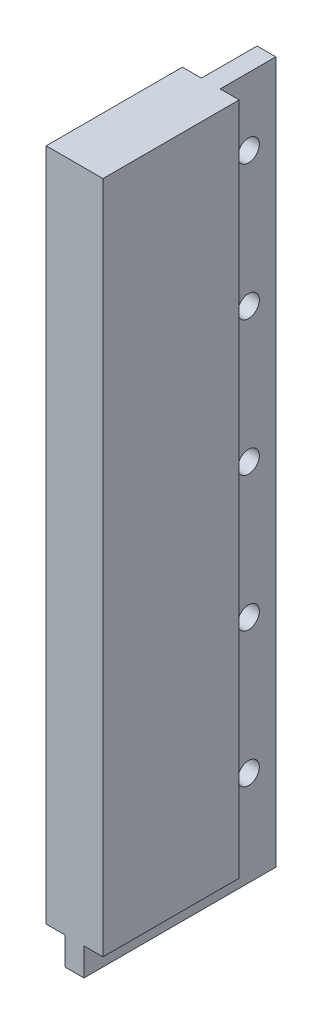
ISO-10303-21;
HEADER;
FILE_DESCRIPTION(('STEP AP214'),'2;1');
FILE_NAME('part.step','',(''),(''),'','','');
FILE_SCHEMA(('AUTOMOTIVE_DESIGN { 1 0 10303 214 1 1 1 1 }'));
ENDSEC;
DATA;
#1=APPLICATION_CONTEXT('core data for automotive mechanical design processes');
#2=APPLICATION_PROTOCOL_DEFINITION('international standard','automotive_design',2000,#1);
#3=PRODUCT_CONTEXT('',#1,'mechanical');
#4=PRODUCT('Part','Part','',(#3));
#5=PRODUCT_RELATED_PRODUCT_CATEGORY('part','',(#4));
#6=PRODUCT_DEFINITION_FORMATION('','',#4);
#7=PRODUCT_DEFINITION_CONTEXT('part definition',#1,'design');
#8=PRODUCT_DEFINITION('design','',#6,#7);
#9=PRODUCT_DEFINITION_SHAPE('','',#8);
#10=(LENGTH_UNIT() NAMED_UNIT(*) SI_UNIT(.MILLI.,.METRE.));
#11=(NAMED_UNIT(*) PLANE_ANGLE_UNIT() SI_UNIT($,.RADIAN.));
#12=(NAMED_UNIT(*) SI_UNIT($,.STERADIAN.) SOLID_ANGLE_UNIT());
#13=UNCERTAINTY_MEASURE_WITH_UNIT(LENGTH_MEASURE(1.E-05),#10,'distance_accuracy_value','');
#14=(GEOMETRIC_REPRESENTATION_CONTEXT(3) GLOBAL_UNCERTAINTY_ASSIGNED_CONTEXT((#13)) GLOBAL_UNIT_ASSIGNED_CONTEXT((#10,
#11,#12)) REPRESENTATION_CONTEXT('',''));
#15=CARTESIAN_POINT('',(0.,0.,0.));
#16=DIRECTION('',(0.,0.,1.));
#17=DIRECTION('',(1.,0.,0.));
#18=AXIS2_PLACEMENT_3D('',#15,#16,#17);
#19=CARTESIAN_POINT('',(0.00100000000000013,11.875,-5.00000000000001));
#20=DIRECTION('',(-1.,0.,0.));
#21=DIRECTION('',(0.,0.,1.));
#22=AXIS2_PLACEMENT_3D('',#19,#20,#21);
#23=CYLINDRICAL_SURFACE('',#22,1.9);
#24=CARTESIAN_POINT('',(-6.65,11.875,-5.00000000000001));
#25=DIRECTION('',(-1.,0.,0.));
#26=DIRECTION('',(0.,0.,1.));
#27=AXIS2_PLACEMENT_3D('',#24,#25,#26);
#28=CIRCLE('',#27,1.9);
#29=CARTESIAN_POINT('',(-6.65,11.875,-3.10000000000001));
#30=VERTEX_POINT('',#29);
#31=EDGE_CURVE('E55',#30,#30,#28,.T.);
#32=CARTESIAN_POINT('',(-3.35,11.875,-5.00000000000001));
#33=DIRECTION('',(-1.,0.,0.));
#34=DIRECTION('',(0.,0.,1.));
#35=AXIS2_PLACEMENT_3D('',#32,#33,#34);
#36=CIRCLE('',#35,1.9);
#37=CARTESIAN_POINT('',(-3.35,11.875,-3.10000000000001));
#38=VERTEX_POINT('',#37);
#39=EDGE_CURVE('E11',#38,#38,#36,.F.);
#40=CARTESIAN_POINT('',(-6.65,11.875,-3.10000000000001));
#41=CARTESIAN_POINT('',(-6.615625,11.875,-3.10000000000001));
#42=CARTESIAN_POINT('',(-6.58125,11.875,-3.10000000000001));
#43=CARTESIAN_POINT('',(-6.5125,11.875,-3.10000000000001));
#44=CARTESIAN_POINT('',(-6.478125,11.875,-3.10000000000001));
#45=CARTESIAN_POINT('',(-6.409375,11.875,-3.10000000000001));
#46=CARTESIAN_POINT('',(-6.375,11.875,-3.10000000000001));
#47=CARTESIAN_POINT('',(-6.30625,11.875,-3.10000000000001));
#48=CARTESIAN_POINT('',(-6.271875,11.875,-3.10000000000001));
#49=CARTESIAN_POINT('',(-6.203125,11.875,-3.10000000000001));
#50=CARTESIAN_POINT('',(-6.16875,11.875,-3.10000000000001));
#51=CARTESIAN_POINT('',(-6.1,11.875,-3.10000000000001));
#52=CARTESIAN_POINT('',(-6.065625,11.875,-3.10000000000001));
#53=CARTESIAN_POINT('',(-5.996875,11.875,-3.10000000000001));
#54=CARTESIAN_POINT('',(-5.9625,11.875,-3.10000000000001));
#55=CARTESIAN_POINT('',(-5.89375,11.875,-3.10000000000001));
#56=CARTESIAN_POINT('',(-5.859375,11.875,-3.10000000000001));
#57=CARTESIAN_POINT('',(-5.790625,11.875,-3.10000000000001));
#58=CARTESIAN_POINT('',(-5.75625,11.875,-3.10000000000001));
#59=CARTESIAN_POINT('',(-5.6875,11.875,-3.10000000000001));
#60=CARTESIAN_POINT('',(-5.653125,11.875,-3.10000000000001));
#61=CARTESIAN_POINT('',(-5.584375,11.875,-3.10000000000001));
#62=CARTESIAN_POINT('',(-5.55,11.875,-3.10000000000001));
#63=CARTESIAN_POINT('',(-5.48125,11.875,-3.10000000000001));
#64=CARTESIAN_POINT('',(-5.446875,11.875,-3.10000000000001));
#65=CARTESIAN_POINT('',(-5.378125,11.875,-3.10000000000001));
#66=CARTESIAN_POINT('',(-5.34375,11.875,-3.10000000000001));
#67=CARTESIAN_POINT('',(-5.275,11.875,-3.10000000000001));
#68=CARTESIAN_POINT('',(-5.240625,11.875,-3.10000000000001));
#69=CARTESIAN_POINT('',(-5.171875,11.875,-3.10000000000001));
#70=CARTESIAN_POINT('',(-5.1375,11.875,-3.10000000000001));
#71=CARTESIAN_POINT('',(-5.06875,11.875,-3.10000000000001));
#72=CARTESIAN_POINT('',(-5.034375,11.875,-3.10000000000001));
#73=CARTESIAN_POINT('',(-4.965625,11.875,-3.10000000000001));
#74=CARTESIAN_POINT('',(-4.93125,11.875,-3.10000000000001));
#75=CARTESIAN_POINT('',(-4.8625,11.875,-3.10000000000001));
#76=CARTESIAN_POINT('',(-4.828125,11.875,-3.10000000000001));
#77=CARTESIAN_POINT('',(-4.759375,11.875,-3.10000000000001));
#78=CARTESIAN_POINT('',(-4.725,11.875,-3.10000000000001));
#79=CARTESIAN_POINT('',(-4.65625,11.875,-3.10000000000001));
#80=CARTESIAN_POINT('',(-4.621875,11.875,-3.10000000000001));
#81=CARTESIAN_POINT('',(-4.553125,11.875,-3.10000000000001));
#82=CARTESIAN_POINT('',(-4.51875,11.875,-3.10000000000001));
#83=CARTESIAN_POINT('',(-4.45,11.875,-3.10000000000001));
#84=CARTESIAN_POINT('',(-4.415625,11.875,-3.10000000000001));
#85=CARTESIAN_POINT('',(-4.346875,11.875,-3.10000000000001));
#86=CARTESIAN_POINT('',(-4.3125,11.875,-3.10000000000001));
#87=CARTESIAN_POINT('',(-4.24375,11.875,-3.10000000000001));
#88=CARTESIAN_POINT('',(-4.209375,11.875,-3.10000000000001));
#89=CARTESIAN_POINT('',(-4.140625,11.875,-3.10000000000001));
#90=CARTESIAN_POINT('',(-4.10625,11.875,-3.10000000000001));
#91=CARTESIAN_POINT('',(-4.0375,11.875,-3.10000000000001));
#92=CARTESIAN_POINT('',(-4.003125,11.875,-3.10000000000001));
#93=CARTESIAN_POINT('',(-3.934375,11.875,-3.10000000000001));
#94=CARTESIAN_POINT('',(-3.9,11.875,-3.10000000000001));
#95=CARTESIAN_POINT('',(-3.83125,11.875,-3.10000000000001));
#96=CARTESIAN_POINT('',(-3.796875,11.875,-3.10000000000001));
#97=CARTESIAN_POINT('',(-3.728125,11.875,-3.10000000000001));
#98=CARTESIAN_POINT('',(-3.69375,11.875,-3.10000000000001));
#99=CARTESIAN_POINT('',(-3.625,11.875,-3.10000000000001));
#100=CARTESIAN_POINT('',(-3.590625,11.875,-3.10000000000001));
#101=CARTESIAN_POINT('',(-3.521875,11.875,-3.10000000000001));
#102=CARTESIAN_POINT('',(-3.4875,11.875,-3.10000000000001));
#103=CARTESIAN_POINT('',(-3.41875,11.875,-3.10000000000001));
#104=CARTESIAN_POINT('',(-3.384375,11.875,-3.10000000000001));
#105=CARTESIAN_POINT('',(-3.35,11.875,-3.10000000000001));
#106=B_SPLINE_CURVE_WITH_KNOTS('',3,(#40,#41,#42,#43,#44,#45,#46,#47,#48,#49,#50,#51,#52,#53,
#54,#55,#56,#57,#58,#59,#60,#61,#62,#63,#64,#65,#66,#67,#68,#69,#70,#71,#72,#73,#74,#75,#76,#77,
#78,#79,#80,#81,#82,#83,#84,#85,#86,#87,#88,#89,#90,#91,#92,#93,#94,#95,#96,#97,#98,#99,#100,
#101,#102,#103,#104,#105),.UNSPECIFIED.,.F.,.F.,(4,2,2,2,2,2,2,2,2,2,2,2,2,2,2,2,2,2,2,2,2,2,2,
2,2,2,2,2,2,2,2,2,4),(0.,0.103125,0.20625,0.309375,0.4125,0.515625,0.618749999999999,0.721875,
0.824999999999999,0.928125,1.03125,1.134375,1.2375,1.340625,1.44375,1.546875,1.65,1.753125,
1.85625,1.959375,2.0625,2.165625,2.26875,2.371875,2.475,2.578125,2.68125,2.784375,2.8875,
2.990625,3.09375,3.196875,3.3),.UNSPECIFIED.);
#107=EDGE_CURVE('BSEAM47',#30,#38,#106,.T.);
#108=ORIENTED_EDGE('',*,*,#31,.T.);
#109=ORIENTED_EDGE('',*,*,#39,.T.);
#110=ORIENTED_EDGE('',*,*,#107,.T.);
#111=ORIENTED_EDGE('',*,*,#107,.F.);
#112=EDGE_LOOP('',(#108,#110,#109,#111));
#113=FACE_BOUND('',#112,.T.);
#114=ADVANCED_FACE('F47',(#113),#23,.F.);
#115=CARTESIAN_POINT('',(0.00100000000000013,35.625,-5.00000000000001));
#116=DIRECTION('',(-1.,0.,0.));
#117=DIRECTION('',(0.,0.,1.));
#118=AXIS2_PLACEMENT_3D('',#115,#116,#117);
#119=CYLINDRICAL_SURFACE('',#118,1.9);
#120=CARTESIAN_POINT('',(-6.65,35.625,-5.00000000000001));
#121=DIRECTION('',(-1.,0.,0.));
#122=DIRECTION('',(0.,0.,1.));
#123=AXIS2_PLACEMENT_3D('',#120,#121,#122);
#124=CIRCLE('',#123,1.9);
#125=CARTESIAN_POINT('',(-6.65,35.625,-3.10000000000001));
#126=VERTEX_POINT('',#125);
#127=EDGE_CURVE('E249',#126,#126,#124,.T.);
#128=CARTESIAN_POINT('',(-3.35,35.625,-5.00000000000001));
#129=DIRECTION('',(-1.,0.,0.));
#130=DIRECTION('',(0.,0.,1.));
#131=AXIS2_PLACEMENT_3D('',#128,#129,#130);
#132=CIRCLE('',#131,1.9);
#133=CARTESIAN_POINT('',(-3.35,35.625,-3.10000000000001));
#134=VERTEX_POINT('',#133);
#135=EDGE_CURVE('E253',#134,#134,#132,.F.);
#136=CARTESIAN_POINT('',(-6.65,35.625,-3.10000000000001));
#137=CARTESIAN_POINT('',(-6.615625,35.625,-3.10000000000001));
#138=CARTESIAN_POINT('',(-6.58125,35.625,-3.10000000000001));
#139=CARTESIAN_POINT('',(-6.5125,35.625,-3.10000000000001));
#140=CARTESIAN_POINT('',(-6.478125,35.625,-3.10000000000001));
#141=CARTESIAN_POINT('',(-6.409375,35.625,-3.10000000000001));
#142=CARTESIAN_POINT('',(-6.375,35.625,-3.10000000000001));
#143=CARTESIAN_POINT('',(-6.30625,35.625,-3.10000000000001));
#144=CARTESIAN_POINT('',(-6.271875,35.625,-3.10000000000001));
#145=CARTESIAN_POINT('',(-6.203125,35.625,-3.10000000000001));
#146=CARTESIAN_POINT('',(-6.16875,35.625,-3.10000000000001));
#147=CARTESIAN_POINT('',(-6.1,35.625,-3.10000000000001));
#148=CARTESIAN_POINT('',(-6.065625,35.625,-3.10000000000001));
#149=CARTESIAN_POINT('',(-5.996875,35.625,-3.10000000000001));
#150=CARTESIAN_POINT('',(-5.9625,35.625,-3.10000000000001));
#151=CARTESIAN_POINT('',(-5.89375,35.625,-3.10000000000001));
#152=CARTESIAN_POINT('',(-5.859375,35.625,-3.10000000000001));
#153=CARTESIAN_POINT('',(-5.790625,35.625,-3.10000000000001));
#154=CARTESIAN_POINT('',(-5.75625,35.625,-3.10000000000001));
#155=CARTESIAN_POINT('',(-5.6875,35.625,-3.10000000000001));
#156=CARTESIAN_POINT('',(-5.653125,35.625,-3.10000000000001));
#157=CARTESIAN_POINT('',(-5.584375,35.625,-3.10000000000001));
#158=CARTESIAN_POINT('',(-5.55,35.625,-3.10000000000001));
#159=CARTESIAN_POINT('',(-5.48125,35.625,-3.10000000000001));
#160=CARTESIAN_POINT('',(-5.446875,35.625,-3.10000000000001));
#161=CARTESIAN_POINT('',(-5.378125,35.625,-3.10000000000001));
#162=CARTESIAN_POINT('',(-5.34375,35.625,-3.10000000000001));
#163=CARTESIAN_POINT('',(-5.275,35.625,-3.10000000000001));
#164=CARTESIAN_POINT('',(-5.240625,35.625,-3.10000000000001));
#165=CARTESIAN_POINT('',(-5.171875,35.625,-3.10000000000001));
#166=CARTESIAN_POINT('',(-5.1375,35.625,-3.10000000000001));
#167=CARTESIAN_POINT('',(-5.06875,35.625,-3.10000000000001));
#168=CARTESIAN_POINT('',(-5.034375,35.625,-3.10000000000001));
#169=CARTESIAN_POINT('',(-4.965625,35.625,-3.10000000000001));
#170=CARTESIAN_POINT('',(-4.93125,35.625,-3.10000000000001));
#171=CARTESIAN_POINT('',(-4.8625,35.625,-3.10000000000001));
#172=CARTESIAN_POINT('',(-4.828125,35.625,-3.10000000000001));
#173=CARTESIAN_POINT('',(-4.759375,35.625,-3.10000000000001));
#174=CARTESIAN_POINT('',(-4.725,35.625,-3.10000000000001));
#175=CARTESIAN_POINT('',(-4.65625,35.625,-3.10000000000001));
#176=CARTESIAN_POINT('',(-4.621875,35.625,-3.10000000000001));
#177=CARTESIAN_POINT('',(-4.553125,35.625,-3.10000000000001));
#178=CARTESIAN_POINT('',(-4.51875,35.625,-3.10000000000001));
#179=CARTESIAN_POINT('',(-4.45,35.625,-3.10000000000001));
#180=CARTESIAN_POINT('',(-4.415625,35.625,-3.10000000000001));
#181=CARTESIAN_POINT('',(-4.346875,35.625,-3.10000000000001));
#182=CARTESIAN_POINT('',(-4.3125,35.625,-3.10000000000001));
#183=CARTESIAN_POINT('',(-4.24375,35.625,-3.10000000000001));
#184=CARTESIAN_POINT('',(-4.209375,35.625,-3.10000000000001));
#185=CARTESIAN_POINT('',(-4.140625,35.625,-3.10000000000001));
#186=CARTESIAN_POINT('',(-4.10625,35.625,-3.10000000000001));
#187=CARTESIAN_POINT('',(-4.0375,35.625,-3.10000000000001));
#188=CARTESIAN_POINT('',(-4.003125,35.625,-3.10000000000001));
#189=CARTESIAN_POINT('',(-3.934375,35.625,-3.10000000000001));
#190=CARTESIAN_POINT('',(-3.9,35.625,-3.10000000000001));
#191=CARTESIAN_POINT('',(-3.83125,35.625,-3.10000000000001));
#192=CARTESIAN_POINT('',(-3.796875,35.625,-3.10000000000001));
#193=CARTESIAN_POINT('',(-3.728125,35.625,-3.10000000000001));
#194=CARTESIAN_POINT('',(-3.69375,35.625,-3.10000000000001));
#195=CARTESIAN_POINT('',(-3.625,35.625,-3.10000000000001));
#196=CARTESIAN_POINT('',(-3.590625,35.625,-3.10000000000001));
#197=CARTESIAN_POINT('',(-3.521875,35.625,-3.10000000000001));
#198=CARTESIAN_POINT('',(-3.4875,35.625,-3.10000000000001));
#199=CARTESIAN_POINT('',(-3.41875,35.625,-3.10000000000001));
#200=CARTESIAN_POINT('',(-3.384375,35.625,-3.10000000000001));
#201=CARTESIAN_POINT('',(-3.35,35.625,-3.10000000000001));
#202=B_SPLINE_CURVE_WITH_KNOTS('',3,(#136,#137,#138,#139,#140,#141,#142,#143,#144,#145,#146,
#147,#148,#149,#150,#151,#152,#153,#154,#155,#156,#157,#158,#159,#160,#161,#162,#163,#164,#165,
#166,#167,#168,#169,#170,#171,#172,#173,#174,#175,#176,#177,#178,#179,#180,#181,#182,#183,#184,
#185,#186,#187,#188,#189,#190,#191,#192,#193,#194,#195,#196,#197,#198,#199,#200,#201),
.UNSPECIFIED.,.F.,.F.,(4,2,2,2,2,2,2,2,2,2,2,2,2,2,2,2,2,2,2,2,2,2,2,2,2,2,2,2,2,2,2,2,4),(0.,
0.103125,0.20625,0.309375,0.4125,0.515625,0.618749999999999,0.721875,0.824999999999999,0.928125,
1.03125,1.134375,1.2375,1.340625,1.44375,1.546875,1.65,1.753125,1.85625,1.959375,2.0625,
2.165625,2.26875,2.371875,2.475,2.578125,2.68125,2.784375,2.8875,2.990625,3.09375,3.196875,3.3),.UNSPECIFIED.);
#203=EDGE_CURVE('BSEAM282',#126,#134,#202,.T.);
#204=ORIENTED_EDGE('',*,*,#127,.T.);
#205=ORIENTED_EDGE('',*,*,#135,.T.);
#206=ORIENTED_EDGE('',*,*,#203,.T.);
#207=ORIENTED_EDGE('',*,*,#203,.F.);
#208=EDGE_LOOP('',(#204,#206,#205,#207));
#209=FACE_BOUND('',#208,.T.);
#210=ADVANCED_FACE('F282',(#209),#119,.F.);
#211=CARTESIAN_POINT('',(0.00100000000000013,59.375,-5.00000000000001));
#212=DIRECTION('',(-1.,0.,0.));
#213=DIRECTION('',(0.,0.,1.));
#214=AXIS2_PLACEMENT_3D('',#211,#212,#213);
#215=CYLINDRICAL_SURFACE('',#214,1.9);
#216=CARTESIAN_POINT('',(-6.65,59.375,-5.00000000000001));
#217=DIRECTION('',(-1.,0.,0.));
#218=DIRECTION('',(0.,0.,1.));
#219=AXIS2_PLACEMENT_3D('',#216,#217,#218);
#220=CIRCLE('',#219,1.9);
#221=CARTESIAN_POINT('',(-6.65,59.375,-3.1));
#222=VERTEX_POINT('',#221);
#223=EDGE_CURVE('E169',#222,#222,#220,.T.);
#224=CARTESIAN_POINT('',(-3.35,59.375,-5.00000000000001));
#225=DIRECTION('',(-1.,0.,0.));
#226=DIRECTION('',(0.,0.,1.));
#227=AXIS2_PLACEMENT_3D('',#224,#225,#226);
#228=CIRCLE('',#227,1.9);
#229=CARTESIAN_POINT('',(-3.35,59.375,-3.1));
#230=VERTEX_POINT('',#229);
#231=EDGE_CURVE('E245',#230,#230,#228,.F.);
#232=CARTESIAN_POINT('',(-6.65,59.375,-3.1));
#233=CARTESIAN_POINT('',(-6.615625,59.375,-3.1));
#234=CARTESIAN_POINT('',(-6.58125,59.375,-3.1));
#235=CARTESIAN_POINT('',(-6.5125,59.375,-3.1));
#236=CARTESIAN_POINT('',(-6.478125,59.375,-3.1));
#237=CARTESIAN_POINT('',(-6.409375,59.375,-3.1));
#238=CARTESIAN_POINT('',(-6.375,59.375,-3.1));
#239=CARTESIAN_POINT('',(-6.30625,59.375,-3.1));
#240=CARTESIAN_POINT('',(-6.271875,59.375,-3.1));
#241=CARTESIAN_POINT('',(-6.203125,59.375,-3.1));
#242=CARTESIAN_POINT('',(-6.16875,59.375,-3.1));
#243=CARTESIAN_POINT('',(-6.1,59.375,-3.1));
#244=CARTESIAN_POINT('',(-6.065625,59.375,-3.1));
#245=CARTESIAN_POINT('',(-5.996875,59.375,-3.1));
#246=CARTESIAN_POINT('',(-5.9625,59.375,-3.1));
#247=CARTESIAN_POINT('',(-5.89375,59.375,-3.1));
#248=CARTESIAN_POINT('',(-5.859375,59.375,-3.1));
#249=CARTESIAN_POINT('',(-5.790625,59.375,-3.1));
#250=CARTESIAN_POINT('',(-5.75625,59.375,-3.1));
#251=CARTESIAN_POINT('',(-5.6875,59.375,-3.1));
#252=CARTESIAN_POINT('',(-5.653125,59.375,-3.1));
#253=CARTESIAN_POINT('',(-5.584375,59.375,-3.1));
#254=CARTESIAN_POINT('',(-5.55,59.375,-3.1));
#255=CARTESIAN_POINT('',(-5.48125,59.375,-3.1));
#256=CARTESIAN_POINT('',(-5.446875,59.375,-3.1));
#257=CARTESIAN_POINT('',(-5.378125,59.375,-3.1));
#258=CARTESIAN_POINT('',(-5.34375,59.375,-3.1));
#259=CARTESIAN_POINT('',(-5.275,59.375,-3.1));
#260=CARTESIAN_POINT('',(-5.240625,59.375,-3.1));
#261=CARTESIAN_POINT('',(-5.171875,59.375,-3.1));
#262=CARTESIAN_POINT('',(-5.1375,59.375,-3.1));
#263=CARTESIAN_POINT('',(-5.06875,59.375,-3.1));
#264=CARTESIAN_POINT('',(-5.034375,59.375,-3.1));
#265=CARTESIAN_POINT('',(-4.965625,59.375,-3.1));
#266=CARTESIAN_POINT('',(-4.93125,59.375,-3.1));
#267=CARTESIAN_POINT('',(-4.8625,59.375,-3.1));
#268=CARTESIAN_POINT('',(-4.828125,59.375,-3.1));
#269=CARTESIAN_POINT('',(-4.759375,59.375,-3.1));
#270=CARTESIAN_POINT('',(-4.725,59.375,-3.1));
#271=CARTESIAN_POINT('',(-4.65625,59.375,-3.1));
#272=CARTESIAN_POINT('',(-4.621875,59.375,-3.1));
#273=CARTESIAN_POINT('',(-4.553125,59.375,-3.1));
#274=CARTESIAN_POINT('',(-4.51875,59.375,-3.1));
#275=CARTESIAN_POINT('',(-4.45,59.375,-3.1));
#276=CARTESIAN_POINT('',(-4.415625,59.375,-3.1));
#277=CARTESIAN_POINT('',(-4.346875,59.375,-3.1));
#278=CARTESIAN_POINT('',(-4.3125,59.375,-3.1));
#279=CARTESIAN_POINT('',(-4.24375,59.375,-3.1));
#280=CARTESIAN_POINT('',(-4.209375,59.375,-3.1));
#281=CARTESIAN_POINT('',(-4.140625,59.375,-3.1));
#282=CARTESIAN_POINT('',(-4.10625,59.375,-3.1));
#283=CARTESIAN_POINT('',(-4.0375,59.375,-3.1));
#284=CARTESIAN_POINT('',(-4.003125,59.375,-3.1));
#285=CARTESIAN_POINT('',(-3.934375,59.375,-3.1));
#286=CARTESIAN_POINT('',(-3.9,59.375,-3.1));
#287=CARTESIAN_POINT('',(-3.83125,59.375,-3.1));
#288=CARTESIAN_POINT('',(-3.796875,59.375,-3.1));
#289=CARTESIAN_POINT('',(-3.728125,59.375,-3.1));
#290=CARTESIAN_POINT('',(-3.69375,59.375,-3.1));
#291=CARTESIAN_POINT('',(-3.625,59.375,-3.1));
#292=CARTESIAN_POINT('',(-3.590625,59.375,-3.1));
#293=CARTESIAN_POINT('',(-3.521875,59.375,-3.1));
#294=CARTESIAN_POINT('',(-3.4875,59.375,-3.1));
#295=CARTESIAN_POINT('',(-3.41875,59.375,-3.1));
#296=CARTESIAN_POINT('',(-3.384375,59.375,-3.1));
#297=CARTESIAN_POINT('',(-3.35,59.375,-3.1));
#298=B_SPLINE_CURVE_WITH_KNOTS('',3,(#232,#233,#234,#235,#236,#237,#238,#239,#240,#241,#242,
#243,#244,#245,#246,#247,#248,#249,#250,#251,#252,#253,#254,#255,#256,#257,#258,#259,#260,#261,
#262,#263,#264,#265,#266,#267,#268,#269,#270,#271,#272,#273,#274,#275,#276,#277,#278,#279,#280,
#281,#282,#283,#284,#285,#286,#287,#288,#289,#290,#291,#292,#293,#294,#295,#296,#297),
.UNSPECIFIED.,.F.,.F.,(4,2,2,2,2,2,2,2,2,2,2,2,2,2,2,2,2,2,2,2,2,2,2,2,2,2,2,2,2,2,2,2,4),(0.,
0.103125,0.20625,0.309375,0.4125,0.515625,0.618749999999999,0.721875,0.824999999999999,0.928125,
1.03125,1.134375,1.2375,1.340625,1.44375,1.546875,1.65,1.753125,1.85625,1.959375,2.0625,
2.165625,2.26875,2.371875,2.475,2.578125,2.68125,2.784375,2.8875,2.990625,3.09375,3.196875,3.3),.UNSPECIFIED.);
#299=EDGE_CURVE('BSEAM287',#222,#230,#298,.T.);
#300=ORIENTED_EDGE('',*,*,#223,.T.);
#301=ORIENTED_EDGE('',*,*,#231,.T.);
#302=ORIENTED_EDGE('',*,*,#299,.T.);
#303=ORIENTED_EDGE('',*,*,#299,.F.);
#304=EDGE_LOOP('',(#300,#302,#301,#303));
#305=FACE_BOUND('',#304,.T.);
#306=ADVANCED_FACE('F287',(#305),#215,.F.);
#307=CARTESIAN_POINT('',(-10.,0.,0.));
#308=DIRECTION('',(0.,-1.,0.));
#309=DIRECTION('',(0.,0.,-1.));
#310=AXIS2_PLACEMENT_3D('',#307,#308,#309);
#311=PLANE('',#310);
#312=DIRECTION('',(1.,0.,0.));
#313=VECTOR('',#312,1.);
#314=CARTESIAN_POINT('',(-10.,0.,0.));
#315=LINE('',#314,#313);
#316=CARTESIAN_POINT('',(-10.,0.,0.));
#317=VERTEX_POINT('',#316);
#318=CARTESIAN_POINT('',(-6.65,0.,0.));
#319=VERTEX_POINT('',#318);
#320=EDGE_CURVE('E239',#317,#319,#315,.T.);
#321=ORIENTED_EDGE('',*,*,#320,.T.);
#322=DIRECTION('',(0.,0.,1.));
#323=VECTOR('',#322,1.);
#324=CARTESIAN_POINT('',(-6.65,0.,0.));
#325=LINE('',#324,#323);
#326=CARTESIAN_POINT('',(-6.65,0.,24.));
#327=VERTEX_POINT('',#326);
#328=EDGE_CURVE('E62',#319,#327,#325,.T.);
#329=ORIENTED_EDGE('',*,*,#328,.T.);
#330=DIRECTION('',(1.,0.,0.));
#331=VECTOR('',#330,1.);
#332=CARTESIAN_POINT('',(-10.,0.,24.));
#333=LINE('',#332,#331);
#334=CARTESIAN_POINT('',(-10.,0.,24.));
#335=VERTEX_POINT('',#334);
#336=EDGE_CURVE('E174',#335,#327,#333,.T.);
#337=ORIENTED_EDGE('',*,*,#336,.F.);
#338=DIRECTION('',(0.,0.,-1.));
#339=VECTOR('',#338,1.);
#340=CARTESIAN_POINT('',(-10.,0.,0.));
#341=LINE('',#340,#339);
#342=EDGE_CURVE('E197',#335,#317,#341,.T.);
#343=ORIENTED_EDGE('',*,*,#342,.T.);
#344=EDGE_LOOP('',(#321,#329,#337,#343));
#345=FACE_BOUND('',#344,.T.);
#346=ADVANCED_FACE('F291',(#345),#311,.T.);
#347=CARTESIAN_POINT('',(-10.,0.,0.));
#348=DIRECTION('',(0.,0.,-1.));
#349=DIRECTION('',(-1.,0.,0.));
#350=AXIS2_PLACEMENT_3D('',#347,#348,#349);
#351=PLANE('',#350);
#352=DIRECTION('',(1.,0.,0.));
#353=VECTOR('',#352,1.);
#354=CARTESIAN_POINT('',(-10.,118.75,0.));
#355=LINE('',#354,#353);
#356=CARTESIAN_POINT('',(-10.,118.75,0.));
#357=VERTEX_POINT('',#356);
#358=CARTESIAN_POINT('',(-6.65,118.75,0.));
#359=VERTEX_POINT('',#358);
#360=EDGE_CURVE('E235',#357,#359,#355,.T.);
#361=ORIENTED_EDGE('',*,*,#360,.T.);
#362=DIRECTION('',(0.,-1.,0.));
#363=VECTOR('',#362,1.);
#364=CARTESIAN_POINT('',(-6.65,118.75,0.));
#365=LINE('',#364,#363);
#366=EDGE_CURVE('E70',#359,#319,#365,.T.);
#367=ORIENTED_EDGE('',*,*,#366,.T.);
#368=ORIENTED_EDGE('',*,*,#320,.F.);
#369=DIRECTION('',(0.,1.,0.));
#370=VECTOR('',#369,1.);
#371=CARTESIAN_POINT('',(-10.,0.,0.));
#372=LINE('',#371,#370);
#373=EDGE_CURVE('E201',#317,#357,#372,.T.);
#374=ORIENTED_EDGE('',*,*,#373,.T.);
#375=EDGE_LOOP('',(#361,#367,#368,#374));
#376=FACE_BOUND('',#375,.T.);
#377=ADVANCED_FACE('F300',(#376),#351,.T.);
#378=DIRECTION('',(0.,0.,1.));
#379=VECTOR('',#378,1.);
#380=CARTESIAN_POINT('',(-3.35,0.,0.));
#381=LINE('',#380,#379);
#382=CARTESIAN_POINT('',(-3.35,0.,0.));
#383=VERTEX_POINT('',#382);
#384=CARTESIAN_POINT('',(-3.35,0.,24.));
#385=VERTEX_POINT('',#384);
#386=EDGE_CURVE('E170',#383,#385,#381,.T.);
#387=ORIENTED_EDGE('',*,*,#386,.F.);
#388=CARTESIAN_POINT('',(0.,0.,0.));
#389=VERTEX_POINT('',#388);
#390=EDGE_CURVE('E214',#383,#389,#315,.T.);
#391=ORIENTED_EDGE('',*,*,#390,.T.);
#392=DIRECTION('',(0.,0.,-1.));
#393=VECTOR('',#392,1.);
#394=CARTESIAN_POINT('',(0.,0.,0.));
#395=LINE('',#394,#393);
#396=CARTESIAN_POINT('',(0.,0.,24.));
#397=VERTEX_POINT('',#396);
#398=EDGE_CURVE('E190',#397,#389,#395,.T.);
#399=ORIENTED_EDGE('',*,*,#398,.F.);
#400=EDGE_CURVE('E231',#385,#397,#333,.T.);
#401=ORIENTED_EDGE('',*,*,#400,.F.);
#402=EDGE_LOOP('',(#387,#391,#399,#401));
#403=FACE_BOUND('',#402,.T.);
#404=ADVANCED_FACE('F296',(#403),#311,.T.);
#405=CARTESIAN_POINT('',(-10.,0.,24.));
#406=DIRECTION('',(0.,0.,1.));
#407=DIRECTION('',(1.,0.,0.));
#408=AXIS2_PLACEMENT_3D('',#405,#406,#407);
#409=PLANE('',#408);
#410=DIRECTION('',(0.,-1.,0.));
#411=VECTOR('',#410,1.);
#412=CARTESIAN_POINT('',(0.,0.,24.));
#413=LINE('',#412,#411);
#414=CARTESIAN_POINT('',(0.,118.75,24.));
#415=VERTEX_POINT('',#414);
#416=EDGE_CURVE('E202',#415,#397,#413,.T.);
#417=ORIENTED_EDGE('',*,*,#416,.F.);
#418=DIRECTION('',(1.,0.,0.));
#419=VECTOR('',#418,1.);
#420=CARTESIAN_POINT('',(-10.,118.75,24.));
#421=LINE('',#420,#419);
#422=CARTESIAN_POINT('',(-10.,118.75,24.));
#423=VERTEX_POINT('',#422);
#424=EDGE_CURVE('E232',#423,#415,#421,.T.);
#425=ORIENTED_EDGE('',*,*,#424,.F.);
#426=DIRECTION('',(0.,-1.,0.));
#427=VECTOR('',#426,1.);
#428=CARTESIAN_POINT('',(-10.,0.,24.));
#429=LINE('',#428,#427);
#430=EDGE_CURVE('E210',#423,#335,#429,.T.);
#431=ORIENTED_EDGE('',*,*,#430,.T.);
#432=ORIENTED_EDGE('',*,*,#336,.T.);
#433=DIRECTION('',(0.,1.,0.));
#434=VECTOR('',#433,1.);
#435=CARTESIAN_POINT('',(-6.65,-4.9,24.));
#436=LINE('',#435,#434);
#437=CARTESIAN_POINT('',(-6.65,-4.9,24.));
#438=VERTEX_POINT('',#437);
#439=EDGE_CURVE('E166',#438,#327,#436,.T.);
#440=ORIENTED_EDGE('',*,*,#439,.F.);
#441=DIRECTION('',(-1.,0.,0.));
#442=VECTOR('',#441,1.);
#443=CARTESIAN_POINT('',(0.,-4.9,24.));
#444=LINE('',#443,#442);
#445=CARTESIAN_POINT('',(-3.35,-4.9,24.));
#446=VERTEX_POINT('',#445);
#447=EDGE_CURVE('E151',#446,#438,#444,.T.);
#448=ORIENTED_EDGE('',*,*,#447,.F.);
#449=DIRECTION('',(0.,1.,0.));
#450=VECTOR('',#449,1.);
#451=CARTESIAN_POINT('',(-3.35,-4.9,24.));
#452=LINE('',#451,#450);
#453=EDGE_CURVE('E177',#446,#385,#452,.T.);
#454=ORIENTED_EDGE('',*,*,#453,.T.);
#455=ORIENTED_EDGE('',*,*,#400,.T.);
#456=EDGE_LOOP('',(#417,#425,#431,#432,#440,#448,#454,#455));
#457=FACE_BOUND('',#456,.T.);
#458=ADVANCED_FACE('F299',(#457),#409,.T.);
#459=CARTESIAN_POINT('',(-10.,118.75,0.));
#460=DIRECTION('',(0.,1.,0.));
#461=DIRECTION('',(0.,0.,1.));
#462=AXIS2_PLACEMENT_3D('',#459,#460,#461);
#463=PLANE('',#462);
#464=DIRECTION('',(0.,0.,1.));
#465=VECTOR('',#464,1.);
#466=CARTESIAN_POINT('',(0.,118.75,0.));
#467=LINE('',#466,#465);
#468=CARTESIAN_POINT('',(0.,118.75,0.));
#469=VERTEX_POINT('',#468);
#470=EDGE_CURVE('E222',#469,#415,#467,.T.);
#471=ORIENTED_EDGE('',*,*,#470,.F.);
#472=CARTESIAN_POINT('',(-3.35,118.75,0.));
#473=VERTEX_POINT('',#472);
#474=EDGE_CURVE('E238',#473,#469,#355,.T.);
#475=ORIENTED_EDGE('',*,*,#474,.F.);
#476=DIRECTION('',(0.,0.,-1.));
#477=VECTOR('',#476,1.);
#478=CARTESIAN_POINT('',(-3.35,118.75,0.));
#479=LINE('',#478,#477);
#480=CARTESIAN_POINT('',(-3.35,118.75,-9.79999999999999));
#481=VERTEX_POINT('',#480);
#482=EDGE_CURVE('E138',#473,#481,#479,.T.);
#483=ORIENTED_EDGE('',*,*,#482,.T.);
#484=DIRECTION('',(1.,0.,0.));
#485=VECTOR('',#484,1.);
#486=CARTESIAN_POINT('',(0.,118.75,-9.79999999999999));
#487=LINE('',#486,#485);
#488=CARTESIAN_POINT('',(-6.65,118.75,-9.79999999999999));
#489=VERTEX_POINT('',#488);
#490=EDGE_CURVE('E183',#489,#481,#487,.T.);
#491=ORIENTED_EDGE('',*,*,#490,.F.);
#492=DIRECTION('',(0.,0.,-1.));
#493=VECTOR('',#492,1.);
#494=CARTESIAN_POINT('',(-6.65,118.75,0.));
#495=LINE('',#494,#493);
#496=EDGE_CURVE('E132',#359,#489,#495,.T.);
#497=ORIENTED_EDGE('',*,*,#496,.F.);
#498=ORIENTED_EDGE('',*,*,#360,.F.);
#499=DIRECTION('',(0.,0.,1.));
#500=VECTOR('',#499,1.);
#501=CARTESIAN_POINT('',(-10.,118.75,0.));
#502=LINE('',#501,#500);
#503=EDGE_CURVE('E206',#357,#423,#502,.T.);
#504=ORIENTED_EDGE('',*,*,#503,.T.);
#505=ORIENTED_EDGE('',*,*,#424,.T.);
#506=EDGE_LOOP('',(#471,#475,#483,#491,#497,#498,#504,#505));
#507=FACE_BOUND('',#506,.T.);
#508=ADVANCED_FACE('F305',(#507),#463,.T.);
#509=DIRECTION('',(0.,-1.,0.));
#510=VECTOR('',#509,1.);
#511=CARTESIAN_POINT('',(-3.35,118.75,0.));
#512=LINE('',#511,#510);
#513=EDGE_CURVE('E191',#473,#383,#512,.T.);
#514=ORIENTED_EDGE('',*,*,#513,.F.);
#515=ORIENTED_EDGE('',*,*,#474,.T.);
#516=DIRECTION('',(0.,1.,0.));
#517=VECTOR('',#516,1.);
#518=CARTESIAN_POINT('',(0.,0.,0.));
#519=LINE('',#518,#517);
#520=EDGE_CURVE('E218',#389,#469,#519,.T.);
#521=ORIENTED_EDGE('',*,*,#520,.F.);
#522=ORIENTED_EDGE('',*,*,#390,.F.);
#523=EDGE_LOOP('',(#514,#515,#521,#522));
#524=FACE_BOUND('',#523,.T.);
#525=ADVANCED_FACE('F302',(#524),#351,.T.);
#526=CARTESIAN_POINT('',(-10.,0.,0.));
#527=DIRECTION('',(-1.,0.,0.));
#528=DIRECTION('',(0.,0.,1.));
#529=AXIS2_PLACEMENT_3D('',#526,#527,#528);
#530=PLANE('',#529);
#531=ORIENTED_EDGE('',*,*,#342,.F.);
#532=ORIENTED_EDGE('',*,*,#430,.F.);
#533=ORIENTED_EDGE('',*,*,#503,.F.);
#534=ORIENTED_EDGE('',*,*,#373,.F.);
#535=EDGE_LOOP('',(#531,#532,#533,#534));
#536=FACE_BOUND('',#535,.T.);
#537=ADVANCED_FACE('F274',(#536),#530,.T.);
#538=CARTESIAN_POINT('',(0.,0.,0.));
#539=DIRECTION('',(-1.,0.,0.));
#540=DIRECTION('',(0.,0.,1.));
#541=AXIS2_PLACEMENT_3D('',#538,#539,#540);
#542=PLANE('',#541);
#543=ORIENTED_EDGE('',*,*,#398,.T.);
#544=ORIENTED_EDGE('',*,*,#520,.T.);
#545=ORIENTED_EDGE('',*,*,#470,.T.);
#546=ORIENTED_EDGE('',*,*,#416,.T.);
#547=EDGE_LOOP('',(#543,#544,#545,#546));
#548=FACE_BOUND('',#547,.T.);
#549=ADVANCED_FACE('F264',(#548),#542,.F.);
#550=CARTESIAN_POINT('',(-6.65,118.75,0.));
#551=DIRECTION('',(-1.,0.,0.));
#552=DIRECTION('',(0.,0.,1.));
#553=AXIS2_PLACEMENT_3D('',#550,#551,#552);
#554=PLANE('',#553);
#555=CARTESIAN_POINT('',(-6.65,83.125,-5.));
#556=DIRECTION('',(-1.,0.,0.));
#557=DIRECTION('',(0.,0.,1.));
#558=AXIS2_PLACEMENT_3D('',#555,#556,#557);
#559=CIRCLE('',#558,1.9);
#560=CARTESIAN_POINT('',(-6.65,83.125,-3.1));
#561=VERTEX_POINT('',#560);
#562=EDGE_CURVE('E510',#561,#561,#559,.T.);
#563=ORIENTED_EDGE('',*,*,#562,.F.);
#564=EDGE_LOOP('',(#563));
#565=FACE_BOUND('',#564,.T.);
#566=CARTESIAN_POINT('',(-6.65,106.875,-5.));
#567=DIRECTION('',(-1.,0.,0.));
#568=DIRECTION('',(0.,0.,1.));
#569=AXIS2_PLACEMENT_3D('',#566,#567,#568);
#570=CIRCLE('',#569,1.9);
#571=CARTESIAN_POINT('',(-6.65,106.875,-3.1));
#572=VERTEX_POINT('',#571);
#573=EDGE_CURVE('E158',#572,#572,#570,.T.);
#574=ORIENTED_EDGE('',*,*,#573,.F.);
#575=EDGE_LOOP('',(#574));
#576=FACE_BOUND('',#575,.T.);
#577=DIRECTION('',(0.,-1.,0.));
#578=VECTOR('',#577,1.);
#579=CARTESIAN_POINT('',(-6.65,118.75,-9.79999999999999));
#580=LINE('',#579,#578);
#581=CARTESIAN_POINT('',(-6.65,-4.9,-9.8));
#582=VERTEX_POINT('',#581);
#583=EDGE_CURVE('E124',#489,#582,#580,.T.);
#584=ORIENTED_EDGE('',*,*,#583,.T.);
#585=DIRECTION('',(0.,0.,1.));
#586=VECTOR('',#585,1.);
#587=CARTESIAN_POINT('',(-6.65,-4.9,0.));
#588=LINE('',#587,#586);
#589=EDGE_CURVE('E130',#582,#438,#588,.T.);
#590=ORIENTED_EDGE('',*,*,#589,.T.);
#591=ORIENTED_EDGE('',*,*,#439,.T.);
#592=ORIENTED_EDGE('',*,*,#328,.F.);
#593=ORIENTED_EDGE('',*,*,#366,.F.);
#594=ORIENTED_EDGE('',*,*,#496,.T.);
#595=EDGE_LOOP('',(#584,#590,#591,#592,#593,#594));
#596=FACE_BOUND('',#595,.T.);
#597=ORIENTED_EDGE('',*,*,#223,.F.);
#598=EDGE_LOOP('',(#597));
#599=FACE_BOUND('',#598,.T.);
#600=ORIENTED_EDGE('',*,*,#127,.F.);
#601=EDGE_LOOP('',(#600));
#602=FACE_BOUND('',#601,.T.);
#603=ORIENTED_EDGE('',*,*,#31,.F.);
#604=EDGE_LOOP('',(#603));
#605=FACE_BOUND('',#604,.T.);
#606=ADVANCED_FACE('F126',(#565,#576,#596,#599,#602,#605),#554,.T.);
#607=CARTESIAN_POINT('',(-3.35,118.75,0.));
#608=DIRECTION('',(-1.,0.,0.));
#609=DIRECTION('',(0.,0.,1.));
#610=AXIS2_PLACEMENT_3D('',#607,#608,#609);
#611=PLANE('',#610);
#612=CARTESIAN_POINT('',(-3.35,83.125,-5.));
#613=DIRECTION('',(-1.,0.,0.));
#614=DIRECTION('',(0.,0.,1.));
#615=AXIS2_PLACEMENT_3D('',#612,#613,#614);
#616=CIRCLE('',#615,1.9);
#617=CARTESIAN_POINT('',(-3.35,83.125,-3.1));
#618=VERTEX_POINT('',#617);
#619=EDGE_CURVE('E513',#618,#618,#616,.F.);
#620=ORIENTED_EDGE('',*,*,#619,.F.);
#621=EDGE_LOOP('',(#620));
#622=FACE_BOUND('',#621,.T.);
#623=CARTESIAN_POINT('',(-3.35,106.875,-5.));
#624=DIRECTION('',(-1.,0.,0.));
#625=DIRECTION('',(0.,0.,1.));
#626=AXIS2_PLACEMENT_3D('',#623,#624,#625);
#627=CIRCLE('',#626,1.9);
#628=CARTESIAN_POINT('',(-3.35,106.875,-3.1));
#629=VERTEX_POINT('',#628);
#630=EDGE_CURVE('E154',#629,#629,#627,.F.);
#631=ORIENTED_EDGE('',*,*,#630,.F.);
#632=EDGE_LOOP('',(#631));
#633=FACE_BOUND('',#632,.T.);
#634=ORIENTED_EDGE('',*,*,#513,.T.);
#635=ORIENTED_EDGE('',*,*,#386,.T.);
#636=ORIENTED_EDGE('',*,*,#453,.F.);
#637=DIRECTION('',(0.,0.,1.));
#638=VECTOR('',#637,1.);
#639=CARTESIAN_POINT('',(-3.35,-4.9,0.));
#640=LINE('',#639,#638);
#641=CARTESIAN_POINT('',(-3.35,-4.9,-9.8));
#642=VERTEX_POINT('',#641);
#643=EDGE_CURVE('E147',#642,#446,#640,.T.);
#644=ORIENTED_EDGE('',*,*,#643,.F.);
#645=DIRECTION('',(0.,-1.,0.));
#646=VECTOR('',#645,1.);
#647=CARTESIAN_POINT('',(-3.35,118.75,-9.79999999999999));
#648=LINE('',#647,#646);
#649=EDGE_CURVE('E137',#481,#642,#648,.T.);
#650=ORIENTED_EDGE('',*,*,#649,.F.);
#651=ORIENTED_EDGE('',*,*,#482,.F.);
#652=EDGE_LOOP('',(#634,#635,#636,#644,#650,#651));
#653=FACE_BOUND('',#652,.T.);
#654=ORIENTED_EDGE('',*,*,#231,.F.);
#655=EDGE_LOOP('',(#654));
#656=FACE_BOUND('',#655,.T.);
#657=ORIENTED_EDGE('',*,*,#135,.F.);
#658=EDGE_LOOP('',(#657));
#659=FACE_BOUND('',#658,.T.);
#660=ORIENTED_EDGE('',*,*,#39,.F.);
#661=EDGE_LOOP('',(#660));
#662=FACE_BOUND('',#661,.T.);
#663=ADVANCED_FACE('F263',(#622,#633,#653,#656,#659,#662),#611,.F.);
#664=CARTESIAN_POINT('',(0.,118.75,-9.79999999999999));
#665=DIRECTION('',(0.,0.,-1.));
#666=DIRECTION('',(0.,1.,0.));
#667=AXIS2_PLACEMENT_3D('',#664,#665,#666);
#668=PLANE('',#667);
#669=ORIENTED_EDGE('',*,*,#649,.T.);
#670=DIRECTION('',(1.,0.,0.));
#671=VECTOR('',#670,1.);
#672=CARTESIAN_POINT('',(0.,-4.9,-9.8));
#673=LINE('',#672,#671);
#674=EDGE_CURVE('E141',#582,#642,#673,.T.);
#675=ORIENTED_EDGE('',*,*,#674,.F.);
#676=ORIENTED_EDGE('',*,*,#583,.F.);
#677=ORIENTED_EDGE('',*,*,#490,.T.);
#678=EDGE_LOOP('',(#669,#675,#676,#677));
#679=FACE_BOUND('',#678,.T.);
#680=ADVANCED_FACE('F142',(#679),#668,.T.);
#681=CARTESIAN_POINT('',(0.,-4.9,0.));
#682=DIRECTION('',(0.,-1.,0.));
#683=DIRECTION('',(0.,0.,-1.));
#684=AXIS2_PLACEMENT_3D('',#681,#682,#683);
#685=PLANE('',#684);
#686=ORIENTED_EDGE('',*,*,#589,.F.);
#687=ORIENTED_EDGE('',*,*,#674,.T.);
#688=ORIENTED_EDGE('',*,*,#643,.T.);
#689=ORIENTED_EDGE('',*,*,#447,.T.);
#690=EDGE_LOOP('',(#686,#687,#688,#689));
#691=FACE_BOUND('',#690,.T.);
#692=ADVANCED_FACE('F149',(#691),#685,.T.);
#693=CARTESIAN_POINT('',(0.00100000000000013,106.875,-5.));
#694=DIRECTION('',(-1.,0.,0.));
#695=DIRECTION('',(0.,0.,1.));
#696=AXIS2_PLACEMENT_3D('',#693,#694,#695);
#697=CYLINDRICAL_SURFACE('',#696,1.9);
#698=CARTESIAN_POINT('',(-6.65,106.875,-3.1));
#699=CARTESIAN_POINT('',(-6.615625,106.875,-3.1));
#700=CARTESIAN_POINT('',(-6.58125,106.875,-3.1));
#701=CARTESIAN_POINT('',(-6.5125,106.875,-3.1));
#702=CARTESIAN_POINT('',(-6.478125,106.875,-3.1));
#703=CARTESIAN_POINT('',(-6.409375,106.875,-3.1));
#704=CARTESIAN_POINT('',(-6.375,106.875,-3.1));
#705=CARTESIAN_POINT('',(-6.30625,106.875,-3.1));
#706=CARTESIAN_POINT('',(-6.271875,106.875,-3.1));
#707=CARTESIAN_POINT('',(-6.203125,106.875,-3.1));
#708=CARTESIAN_POINT('',(-6.16875,106.875,-3.1));
#709=CARTESIAN_POINT('',(-6.1,106.875,-3.1));
#710=CARTESIAN_POINT('',(-6.065625,106.875,-3.1));
#711=CARTESIAN_POINT('',(-5.996875,106.875,-3.1));
#712=CARTESIAN_POINT('',(-5.9625,106.875,-3.1));
#713=CARTESIAN_POINT('',(-5.89375,106.875,-3.1));
#714=CARTESIAN_POINT('',(-5.859375,106.875,-3.1));
#715=CARTESIAN_POINT('',(-5.790625,106.875,-3.1));
#716=CARTESIAN_POINT('',(-5.75625,106.875,-3.1));
#717=CARTESIAN_POINT('',(-5.6875,106.875,-3.1));
#718=CARTESIAN_POINT('',(-5.653125,106.875,-3.1));
#719=CARTESIAN_POINT('',(-5.584375,106.875,-3.1));
#720=CARTESIAN_POINT('',(-5.55,106.875,-3.1));
#721=CARTESIAN_POINT('',(-5.48125,106.875,-3.1));
#722=CARTESIAN_POINT('',(-5.446875,106.875,-3.1));
#723=CARTESIAN_POINT('',(-5.378125,106.875,-3.1));
#724=CARTESIAN_POINT('',(-5.34375,106.875,-3.1));
#725=CARTESIAN_POINT('',(-5.275,106.875,-3.1));
#726=CARTESIAN_POINT('',(-5.240625,106.875,-3.1));
#727=CARTESIAN_POINT('',(-5.171875,106.875,-3.1));
#728=CARTESIAN_POINT('',(-5.1375,106.875,-3.1));
#729=CARTESIAN_POINT('',(-5.06875,106.875,-3.1));
#730=CARTESIAN_POINT('',(-5.034375,106.875,-3.1));
#731=CARTESIAN_POINT('',(-4.965625,106.875,-3.1));
#732=CARTESIAN_POINT('',(-4.93125,106.875,-3.1));
#733=CARTESIAN_POINT('',(-4.8625,106.875,-3.1));
#734=CARTESIAN_POINT('',(-4.828125,106.875,-3.1));
#735=CARTESIAN_POINT('',(-4.759375,106.875,-3.1));
#736=CARTESIAN_POINT('',(-4.725,106.875,-3.1));
#737=CARTESIAN_POINT('',(-4.65625,106.875,-3.1));
#738=CARTESIAN_POINT('',(-4.621875,106.875,-3.1));
#739=CARTESIAN_POINT('',(-4.553125,106.875,-3.1));
#740=CARTESIAN_POINT('',(-4.51875,106.875,-3.1));
#741=CARTESIAN_POINT('',(-4.45,106.875,-3.1));
#742=CARTESIAN_POINT('',(-4.415625,106.875,-3.1));
#743=CARTESIAN_POINT('',(-4.346875,106.875,-3.1));
#744=CARTESIAN_POINT('',(-4.3125,106.875,-3.1));
#745=CARTESIAN_POINT('',(-4.24375,106.875,-3.1));
#746=CARTESIAN_POINT('',(-4.209375,106.875,-3.1));
#747=CARTESIAN_POINT('',(-4.140625,106.875,-3.1));
#748=CARTESIAN_POINT('',(-4.10625,106.875,-3.1));
#749=CARTESIAN_POINT('',(-4.0375,106.875,-3.1));
#750=CARTESIAN_POINT('',(-4.003125,106.875,-3.1));
#751=CARTESIAN_POINT('',(-3.934375,106.875,-3.1));
#752=CARTESIAN_POINT('',(-3.9,106.875,-3.1));
#753=CARTESIAN_POINT('',(-3.83125,106.875,-3.1));
#754=CARTESIAN_POINT('',(-3.796875,106.875,-3.1));
#755=CARTESIAN_POINT('',(-3.728125,106.875,-3.1));
#756=CARTESIAN_POINT('',(-3.69375,106.875,-3.1));
#757=CARTESIAN_POINT('',(-3.625,106.875,-3.1));
#758=CARTESIAN_POINT('',(-3.590625,106.875,-3.1));
#759=CARTESIAN_POINT('',(-3.521875,106.875,-3.1));
#760=CARTESIAN_POINT('',(-3.4875,106.875,-3.1));
#761=CARTESIAN_POINT('',(-3.41875,106.875,-3.1));
#762=CARTESIAN_POINT('',(-3.384375,106.875,-3.1));
#763=CARTESIAN_POINT('',(-3.35,106.875,-3.1));
#764=B_SPLINE_CURVE_WITH_KNOTS('',3,(#698,#699,#700,#701,#702,#703,#704,#705,#706,#707,#708,
#709,#710,#711,#712,#713,#714,#715,#716,#717,#718,#719,#720,#721,#722,#723,#724,#725,#726,#727,
#728,#729,#730,#731,#732,#733,#734,#735,#736,#737,#738,#739,#740,#741,#742,#743,#744,#745,#746,
#747,#748,#749,#750,#751,#752,#753,#754,#755,#756,#757,#758,#759,#760,#761,#762,#763),
.UNSPECIFIED.,.F.,.F.,(4,2,2,2,2,2,2,2,2,2,2,2,2,2,2,2,2,2,2,2,2,2,2,2,2,2,2,2,2,2,2,2,4),(0.,
0.103125,0.20625,0.309375,0.4125,0.515625,0.618749999999999,0.721875,0.824999999999999,0.928125,
1.03125,1.134375,1.2375,1.340625,1.44375,1.546875,1.65,1.753125,1.85625,1.959375,2.0625,
2.165625,2.26875,2.371875,2.475,2.578125,2.68125,2.784375,2.8875,2.990625,3.09375,3.196875,3.3),.UNSPECIFIED.);
#765=EDGE_CURVE('BSEAM377',#572,#629,#764,.T.);
#766=ORIENTED_EDGE('',*,*,#573,.T.);
#767=ORIENTED_EDGE('',*,*,#630,.T.);
#768=ORIENTED_EDGE('',*,*,#765,.T.);
#769=ORIENTED_EDGE('',*,*,#765,.F.);
#770=EDGE_LOOP('',(#766,#768,#767,#769));
#771=FACE_BOUND('',#770,.T.);
#772=ADVANCED_FACE('F377',(#771),#697,.F.);
#773=CARTESIAN_POINT('',(0.00100000000000013,83.125,-5.));
#774=DIRECTION('',(-1.,0.,0.));
#775=DIRECTION('',(0.,0.,1.));
#776=AXIS2_PLACEMENT_3D('',#773,#774,#775);
#777=CYLINDRICAL_SURFACE('',#776,1.9);
#778=CARTESIAN_POINT('',(-6.65,83.125,-3.1));
#779=CARTESIAN_POINT('',(-6.615625,83.125,-3.1));
#780=CARTESIAN_POINT('',(-6.58125,83.125,-3.1));
#781=CARTESIAN_POINT('',(-6.5125,83.125,-3.1));
#782=CARTESIAN_POINT('',(-6.478125,83.125,-3.1));
#783=CARTESIAN_POINT('',(-6.409375,83.125,-3.1));
#784=CARTESIAN_POINT('',(-6.375,83.125,-3.1));
#785=CARTESIAN_POINT('',(-6.30625,83.125,-3.1));
#786=CARTESIAN_POINT('',(-6.271875,83.125,-3.1));
#787=CARTESIAN_POINT('',(-6.203125,83.125,-3.1));
#788=CARTESIAN_POINT('',(-6.16875,83.125,-3.1));
#789=CARTESIAN_POINT('',(-6.1,83.125,-3.1));
#790=CARTESIAN_POINT('',(-6.065625,83.125,-3.1));
#791=CARTESIAN_POINT('',(-5.996875,83.125,-3.1));
#792=CARTESIAN_POINT('',(-5.9625,83.125,-3.1));
#793=CARTESIAN_POINT('',(-5.89375,83.125,-3.1));
#794=CARTESIAN_POINT('',(-5.859375,83.125,-3.1));
#795=CARTESIAN_POINT('',(-5.790625,83.125,-3.1));
#796=CARTESIAN_POINT('',(-5.75625,83.125,-3.1));
#797=CARTESIAN_POINT('',(-5.6875,83.125,-3.1));
#798=CARTESIAN_POINT('',(-5.653125,83.125,-3.1));
#799=CARTESIAN_POINT('',(-5.584375,83.125,-3.1));
#800=CARTESIAN_POINT('',(-5.55,83.125,-3.1));
#801=CARTESIAN_POINT('',(-5.48125,83.125,-3.1));
#802=CARTESIAN_POINT('',(-5.446875,83.125,-3.1));
#803=CARTESIAN_POINT('',(-5.378125,83.125,-3.1));
#804=CARTESIAN_POINT('',(-5.34375,83.125,-3.1));
#805=CARTESIAN_POINT('',(-5.275,83.125,-3.1));
#806=CARTESIAN_POINT('',(-5.240625,83.125,-3.1));
#807=CARTESIAN_POINT('',(-5.171875,83.125,-3.1));
#808=CARTESIAN_POINT('',(-5.1375,83.125,-3.1));
#809=CARTESIAN_POINT('',(-5.06875,83.125,-3.1));
#810=CARTESIAN_POINT('',(-5.034375,83.125,-3.1));
#811=CARTESIAN_POINT('',(-4.965625,83.125,-3.1));
#812=CARTESIAN_POINT('',(-4.93125,83.125,-3.1));
#813=CARTESIAN_POINT('',(-4.8625,83.125,-3.1));
#814=CARTESIAN_POINT('',(-4.828125,83.125,-3.1));
#815=CARTESIAN_POINT('',(-4.759375,83.125,-3.1));
#816=CARTESIAN_POINT('',(-4.725,83.125,-3.1));
#817=CARTESIAN_POINT('',(-4.65625,83.125,-3.1));
#818=CARTESIAN_POINT('',(-4.621875,83.125,-3.1));
#819=CARTESIAN_POINT('',(-4.553125,83.125,-3.1));
#820=CARTESIAN_POINT('',(-4.51875,83.125,-3.1));
#821=CARTESIAN_POINT('',(-4.45,83.125,-3.1));
#822=CARTESIAN_POINT('',(-4.415625,83.125,-3.1));
#823=CARTESIAN_POINT('',(-4.346875,83.125,-3.1));
#824=CARTESIAN_POINT('',(-4.3125,83.125,-3.1));
#825=CARTESIAN_POINT('',(-4.24375,83.125,-3.1));
#826=CARTESIAN_POINT('',(-4.209375,83.125,-3.1));
#827=CARTESIAN_POINT('',(-4.140625,83.125,-3.1));
#828=CARTESIAN_POINT('',(-4.10625,83.125,-3.1));
#829=CARTESIAN_POINT('',(-4.0375,83.125,-3.1));
#830=CARTESIAN_POINT('',(-4.003125,83.125,-3.1));
#831=CARTESIAN_POINT('',(-3.934375,83.125,-3.1));
#832=CARTESIAN_POINT('',(-3.9,83.125,-3.1));
#833=CARTESIAN_POINT('',(-3.83125,83.125,-3.1));
#834=CARTESIAN_POINT('',(-3.796875,83.125,-3.1));
#835=CARTESIAN_POINT('',(-3.728125,83.125,-3.1));
#836=CARTESIAN_POINT('',(-3.69375,83.125,-3.1));
#837=CARTESIAN_POINT('',(-3.625,83.125,-3.1));
#838=CARTESIAN_POINT('',(-3.590625,83.125,-3.1));
#839=CARTESIAN_POINT('',(-3.521875,83.125,-3.1));
#840=CARTESIAN_POINT('',(-3.4875,83.125,-3.1));
#841=CARTESIAN_POINT('',(-3.41875,83.125,-3.1));
#842=CARTESIAN_POINT('',(-3.384375,83.125,-3.1));
#843=CARTESIAN_POINT('',(-3.35,83.125,-3.1));
#844=B_SPLINE_CURVE_WITH_KNOTS('',3,(#778,#779,#780,#781,#782,#783,#784,#785,#786,#787,#788,
#789,#790,#791,#792,#793,#794,#795,#796,#797,#798,#799,#800,#801,#802,#803,#804,#805,#806,#807,
#808,#809,#810,#811,#812,#813,#814,#815,#816,#817,#818,#819,#820,#821,#822,#823,#824,#825,#826,
#827,#828,#829,#830,#831,#832,#833,#834,#835,#836,#837,#838,#839,#840,#841,#842,#843),
.UNSPECIFIED.,.F.,.F.,(4,2,2,2,2,2,2,2,2,2,2,2,2,2,2,2,2,2,2,2,2,2,2,2,2,2,2,2,2,2,2,2,4),(0.,
0.103125,0.20625,0.309375,0.4125,0.515625,0.618749999999999,0.721875,0.824999999999999,0.928125,
1.03125,1.134375,1.2375,1.340625,1.44375,1.546875,1.65,1.753125,1.85625,1.959375,2.0625,
2.165625,2.26875,2.371875,2.475,2.578125,2.68125,2.784375,2.8875,2.990625,3.09375,3.196875,3.3),.UNSPECIFIED.);
#845=EDGE_CURVE('BSEAM384',#561,#618,#844,.T.);
#846=ORIENTED_EDGE('',*,*,#562,.T.);
#847=ORIENTED_EDGE('',*,*,#619,.T.);
#848=ORIENTED_EDGE('',*,*,#845,.T.);
#849=ORIENTED_EDGE('',*,*,#845,.F.);
#850=EDGE_LOOP('',(#846,#848,#847,#849));
#851=FACE_BOUND('',#850,.T.);
#852=ADVANCED_FACE('F384',(#851),#777,.F.);
#853=CLOSED_SHELL('',(#114,#210,#306,#346,#377,#404,#458,#508,#525,#537,#549,#606,#663,#680,
#692,#772,#852));
#854=MANIFOLD_SOLID_BREP('B2',#853);
#855=ADVANCED_BREP_SHAPE_REPRESENTATION('',(#18,#854),#14);
#856=SHAPE_DEFINITION_REPRESENTATION(#9,#855);
ENDSEC;
END-ISO-10303-21;
